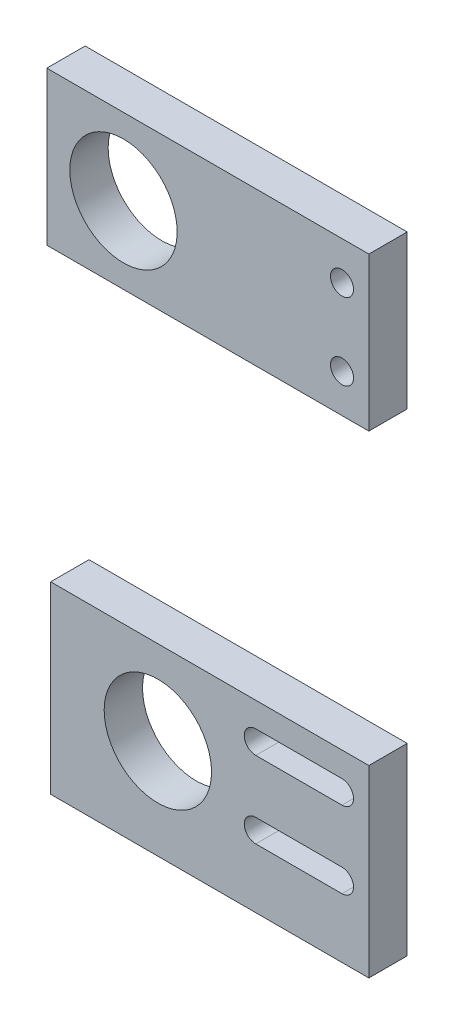
ISO-10303-21;
HEADER;
FILE_DESCRIPTION(('STEP AP214'),'2;1');
FILE_NAME('part.step','',(''),(''),'','','');
FILE_SCHEMA(('AUTOMOTIVE_DESIGN { 1 0 10303 214 1 1 1 1 }'));
ENDSEC;
DATA;
#1=APPLICATION_CONTEXT('core data for automotive mechanical design processes');
#2=APPLICATION_PROTOCOL_DEFINITION('international standard','automotive_design',2000,#1);
#3=PRODUCT_CONTEXT('',#1,'mechanical');
#4=PRODUCT('Part','Part','',(#3));
#5=PRODUCT_RELATED_PRODUCT_CATEGORY('part','',(#4));
#6=PRODUCT_DEFINITION_FORMATION('','',#4);
#7=PRODUCT_DEFINITION_CONTEXT('part definition',#1,'design');
#8=PRODUCT_DEFINITION('design','',#6,#7);
#9=PRODUCT_DEFINITION_SHAPE('','',#8);
#10=(LENGTH_UNIT() NAMED_UNIT(*) SI_UNIT(.MILLI.,.METRE.));
#11=(NAMED_UNIT(*) PLANE_ANGLE_UNIT() SI_UNIT($,.RADIAN.));
#12=(NAMED_UNIT(*) SI_UNIT($,.STERADIAN.) SOLID_ANGLE_UNIT());
#13=UNCERTAINTY_MEASURE_WITH_UNIT(LENGTH_MEASURE(1.E-05),#10,'distance_accuracy_value','');
#14=(GEOMETRIC_REPRESENTATION_CONTEXT(3) GLOBAL_UNCERTAINTY_ASSIGNED_CONTEXT((#13)) GLOBAL_UNIT_ASSIGNED_CONTEXT((#10,
#11,#12)) REPRESENTATION_CONTEXT('',''));
#15=CARTESIAN_POINT('',(0.,0.,0.));
#16=DIRECTION('',(0.,0.,1.));
#17=DIRECTION('',(1.,0.,0.));
#18=AXIS2_PLACEMENT_3D('',#15,#16,#17);
#19=CARTESIAN_POINT('',(0.,0.,-27.08));
#20=DIRECTION('',(0.,0.,-1.));
#21=DIRECTION('',(0.,1.,0.));
#22=AXIS2_PLACEMENT_3D('',#19,#20,#21);
#23=PLANE('',#22);
#24=CARTESIAN_POINT('',(0.,5.,-27.08));
#25=DIRECTION('',(0.,0.,-1.));
#26=DIRECTION('',(0.,1.,0.));
#27=AXIS2_PLACEMENT_3D('',#24,#25,#26);
#28=CIRCLE('',#27,1.5);
#29=CARTESIAN_POINT('',(0.,6.5,-27.08));
#30=VERTEX_POINT('',#29);
#31=EDGE_CURVE('E135',#30,#30,#28,.F.);
#32=ORIENTED_EDGE('',*,*,#31,.F.);
#33=EDGE_LOOP('',(#32));
#34=FACE_BOUND('',#33,.T.);
#35=DIRECTION('',(0.,-1.,0.));
#36=VECTOR('',#35,1.);
#37=CARTESIAN_POINT('',(3.5,0.,-27.08));
#38=LINE('',#37,#36);
#39=CARTESIAN_POINT('',(3.5,10.,-27.08));
#40=VERTEX_POINT('',#39);
#41=CARTESIAN_POINT('',(3.5,-10.,-27.08));
#42=VERTEX_POINT('',#41);
#43=EDGE_CURVE('E56',#40,#42,#38,.T.);
#44=ORIENTED_EDGE('',*,*,#43,.F.);
#45=DIRECTION('',(1.,0.,0.));
#46=VECTOR('',#45,1.);
#47=CARTESIAN_POINT('',(-38.5,10.,-27.08));
#48=LINE('',#47,#46);
#49=CARTESIAN_POINT('',(-38.5,10.,-27.08));
#50=VERTEX_POINT('',#49);
#51=EDGE_CURVE('E95',#50,#40,#48,.T.);
#52=ORIENTED_EDGE('',*,*,#51,.F.);
#53=DIRECTION('',(0.,1.,0.));
#54=VECTOR('',#53,1.);
#55=CARTESIAN_POINT('',(-38.5,10.,-27.08));
#56=LINE('',#55,#54);
#57=CARTESIAN_POINT('',(-38.5,-10.,-27.08));
#58=VERTEX_POINT('',#57);
#59=EDGE_CURVE('E129',#58,#50,#56,.T.);
#60=ORIENTED_EDGE('',*,*,#59,.F.);
#61=DIRECTION('',(-1.,0.,0.));
#62=VECTOR('',#61,1.);
#63=CARTESIAN_POINT('',(-3.5,-10.,-27.08));
#64=LINE('',#63,#62);
#65=EDGE_CURVE('E12',#42,#58,#64,.T.);
#66=ORIENTED_EDGE('',*,*,#65,.F.);
#67=EDGE_LOOP('',(#44,#52,#60,#66));
#68=FACE_BOUND('',#67,.T.);
#69=CARTESIAN_POINT('',(0.,-5.,-27.08));
#70=DIRECTION('',(0.,0.,-1.));
#71=DIRECTION('',(0.,1.,0.));
#72=AXIS2_PLACEMENT_3D('',#69,#70,#71);
#73=CIRCLE('',#72,1.5);
#74=CARTESIAN_POINT('',(0.,-3.5,-27.08));
#75=VERTEX_POINT('',#74);
#76=EDGE_CURVE('E106',#75,#75,#73,.F.);
#77=ORIENTED_EDGE('',*,*,#76,.F.);
#78=EDGE_LOOP('',(#77));
#79=FACE_BOUND('',#78,.T.);
#80=CARTESIAN_POINT('',(-28.5,0.,-27.08));
#81=DIRECTION('',(0.,0.,-1.));
#82=DIRECTION('',(0.,1.,0.));
#83=AXIS2_PLACEMENT_3D('',#80,#81,#82);
#84=CIRCLE('',#83,7.00000000000001);
#85=CARTESIAN_POINT('',(-28.5,7.00000000000001,-27.08));
#86=VERTEX_POINT('',#85);
#87=EDGE_CURVE('E119',#86,#86,#84,.T.);
#88=ORIENTED_EDGE('',*,*,#87,.T.);
#89=EDGE_LOOP('',(#88));
#90=FACE_BOUND('',#89,.T.);
#91=ADVANCED_FACE('F52',(#34,#68,#79,#90),#23,.F.);
#92=CARTESIAN_POINT('',(-38.5,0.,0.));
#93=DIRECTION('',(-1.,0.,0.));
#94=DIRECTION('',(0.,0.,1.));
#95=AXIS2_PLACEMENT_3D('',#92,#93,#94);
#96=PLANE('',#95);
#97=DIRECTION('',(0.,-1.,0.));
#98=VECTOR('',#97,1.);
#99=CARTESIAN_POINT('',(-38.5,10.,-32.08));
#100=LINE('',#99,#98);
#101=CARTESIAN_POINT('',(-38.5,10.,-32.08));
#102=VERTEX_POINT('',#101);
#103=CARTESIAN_POINT('',(-38.5,-10.,-32.08));
#104=VERTEX_POINT('',#103);
#105=EDGE_CURVE('E123',#102,#104,#100,.T.);
#106=ORIENTED_EDGE('',*,*,#105,.T.);
#107=DIRECTION('',(0.,0.,1.));
#108=VECTOR('',#107,1.);
#109=CARTESIAN_POINT('',(-38.5,-10.,-32.08));
#110=LINE('',#109,#108);
#111=EDGE_CURVE('E126',#104,#58,#110,.T.);
#112=ORIENTED_EDGE('',*,*,#111,.T.);
#113=ORIENTED_EDGE('',*,*,#59,.T.);
#114=DIRECTION('',(0.,0.,-1.));
#115=VECTOR('',#114,1.);
#116=CARTESIAN_POINT('',(-38.5,10.,-32.08));
#117=LINE('',#116,#115);
#118=EDGE_CURVE('E99',#50,#102,#117,.T.);
#119=ORIENTED_EDGE('',*,*,#118,.T.);
#120=EDGE_LOOP('',(#106,#112,#113,#119));
#121=FACE_BOUND('',#120,.T.);
#122=ADVANCED_FACE('F144',(#121),#96,.T.);
#123=CARTESIAN_POINT('',(-3.5,10.,-32.08));
#124=DIRECTION('',(0.,0.,-1.));
#125=DIRECTION('',(-1.,0.,0.));
#126=AXIS2_PLACEMENT_3D('',#123,#124,#125);
#127=PLANE('',#126);
#128=CARTESIAN_POINT('',(0.,5.,-32.08));
#129=DIRECTION('',(0.,0.,-1.));
#130=DIRECTION('',(-1.,0.,0.));
#131=AXIS2_PLACEMENT_3D('',#128,#129,#130);
#132=CIRCLE('',#131,1.5);
#133=CARTESIAN_POINT('',(-1.5,5.,-32.08));
#134=VERTEX_POINT('',#133);
#135=EDGE_CURVE('E120',#134,#134,#132,.T.);
#136=ORIENTED_EDGE('',*,*,#135,.F.);
#137=EDGE_LOOP('',(#136));
#138=FACE_BOUND('',#137,.T.);
#139=CARTESIAN_POINT('',(0.,-5.,-32.08));
#140=DIRECTION('',(0.,0.,-1.));
#141=DIRECTION('',(-1.,0.,0.));
#142=AXIS2_PLACEMENT_3D('',#139,#140,#141);
#143=CIRCLE('',#142,1.5);
#144=CARTESIAN_POINT('',(-1.5,-5.,-32.08));
#145=VERTEX_POINT('',#144);
#146=EDGE_CURVE('E133',#145,#145,#143,.T.);
#147=ORIENTED_EDGE('',*,*,#146,.F.);
#148=EDGE_LOOP('',(#147));
#149=FACE_BOUND('',#148,.T.);
#150=CARTESIAN_POINT('',(-28.5,0.,-32.08));
#151=DIRECTION('',(0.,0.,-1.));
#152=DIRECTION('',(-1.,0.,0.));
#153=AXIS2_PLACEMENT_3D('',#150,#151,#152);
#154=CIRCLE('',#153,7.00000000000001);
#155=CARTESIAN_POINT('',(-35.5,0.,-32.08));
#156=VERTEX_POINT('',#155);
#157=EDGE_CURVE('E116',#156,#156,#154,.T.);
#158=ORIENTED_EDGE('',*,*,#157,.F.);
#159=EDGE_LOOP('',(#158));
#160=FACE_BOUND('',#159,.T.);
#161=DIRECTION('',(1.,0.,0.));
#162=VECTOR('',#161,1.);
#163=CARTESIAN_POINT('',(-3.5,10.,-32.08));
#164=LINE('',#163,#162);
#165=CARTESIAN_POINT('',(3.5,10.,-32.08));
#166=VERTEX_POINT('',#165);
#167=EDGE_CURVE('E61',#102,#166,#164,.T.);
#168=ORIENTED_EDGE('',*,*,#167,.T.);
#169=DIRECTION('',(0.,1.,0.));
#170=VECTOR('',#169,1.);
#171=CARTESIAN_POINT('',(3.5,10.,-32.08));
#172=LINE('',#171,#170);
#173=CARTESIAN_POINT('',(3.5,-10.,-32.08));
#174=VERTEX_POINT('',#173);
#175=EDGE_CURVE('E107',#174,#166,#172,.T.);
#176=ORIENTED_EDGE('',*,*,#175,.F.);
#177=DIRECTION('',(1.,0.,0.));
#178=VECTOR('',#177,1.);
#179=CARTESIAN_POINT('',(-3.5,-10.,-32.08));
#180=LINE('',#179,#178);
#181=EDGE_CURVE('E108',#104,#174,#180,.T.);
#182=ORIENTED_EDGE('',*,*,#181,.F.);
#183=ORIENTED_EDGE('',*,*,#105,.F.);
#184=EDGE_LOOP('',(#168,#176,#182,#183));
#185=FACE_BOUND('',#184,.T.);
#186=ADVANCED_FACE('F141',(#138,#149,#160,#185),#127,.T.);
#187=CARTESIAN_POINT('',(3.5,0.,0.));
#188=DIRECTION('',(-1.,0.,0.));
#189=DIRECTION('',(0.,0.,1.));
#190=AXIS2_PLACEMENT_3D('',#187,#188,#189);
#191=PLANE('',#190);
#192=DIRECTION('',(0.,0.,1.));
#193=VECTOR('',#192,1.);
#194=CARTESIAN_POINT('',(3.5,10.,32.08));
#195=LINE('',#194,#193);
#196=EDGE_CURVE('E97',#166,#40,#195,.T.);
#197=ORIENTED_EDGE('',*,*,#196,.T.);
#198=ORIENTED_EDGE('',*,*,#43,.T.);
#199=DIRECTION('',(0.,0.,-1.));
#200=VECTOR('',#199,1.);
#201=CARTESIAN_POINT('',(3.5,-10.,32.08));
#202=LINE('',#201,#200);
#203=EDGE_CURVE('E102',#42,#174,#202,.T.);
#204=ORIENTED_EDGE('',*,*,#203,.T.);
#205=ORIENTED_EDGE('',*,*,#175,.T.);
#206=EDGE_LOOP('',(#197,#198,#204,#205));
#207=FACE_BOUND('',#206,.T.);
#208=ADVANCED_FACE('F54',(#207),#191,.F.);
#209=CARTESIAN_POINT('',(-3.5,10.,32.08));
#210=DIRECTION('',(0.,1.,0.));
#211=DIRECTION('',(0.,0.,1.));
#212=AXIS2_PLACEMENT_3D('',#209,#210,#211);
#213=PLANE('',#212);
#214=ORIENTED_EDGE('',*,*,#51,.T.);
#215=ORIENTED_EDGE('',*,*,#196,.F.);
#216=ORIENTED_EDGE('',*,*,#167,.F.);
#217=ORIENTED_EDGE('',*,*,#118,.F.);
#218=EDGE_LOOP('',(#214,#215,#216,#217));
#219=FACE_BOUND('',#218,.T.);
#220=ADVANCED_FACE('F96',(#219),#213,.T.);
#221=CARTESIAN_POINT('',(-3.5,-10.,32.08));
#222=DIRECTION('',(0.,-1.,0.));
#223=DIRECTION('',(0.,0.,-1.));
#224=AXIS2_PLACEMENT_3D('',#221,#222,#223);
#225=PLANE('',#224);
#226=ORIENTED_EDGE('',*,*,#203,.F.);
#227=ORIENTED_EDGE('',*,*,#65,.T.);
#228=ORIENTED_EDGE('',*,*,#111,.F.);
#229=ORIENTED_EDGE('',*,*,#181,.T.);
#230=EDGE_LOOP('',(#226,#227,#228,#229));
#231=FACE_BOUND('',#230,.T.);
#232=ADVANCED_FACE('F153',(#231),#225,.T.);
#233=CARTESIAN_POINT('',(-28.5,0.,32.08));
#234=DIRECTION('',(0.,0.,-1.));
#235=DIRECTION('',(-1.,0.,0.));
#236=AXIS2_PLACEMENT_3D('',#233,#234,#235);
#237=CYLINDRICAL_SURFACE('',#236,7.00000000000001);
#238=ORIENTED_EDGE('',*,*,#157,.T.);
#239=EDGE_LOOP('',(#238));
#240=FACE_BOUND('',#239,.T.);
#241=ORIENTED_EDGE('',*,*,#87,.F.);
#242=EDGE_LOOP('',(#241));
#243=FACE_BOUND('',#242,.T.);
#244=ADVANCED_FACE('F150',(#240,#243),#237,.F.);
#245=CARTESIAN_POINT('',(0.,5.,-39.58));
#246=DIRECTION('',(0.,0.,1.));
#247=DIRECTION('',(1.,0.,0.));
#248=AXIS2_PLACEMENT_3D('',#245,#246,#247);
#249=CYLINDRICAL_SURFACE('',#248,1.5);
#250=ORIENTED_EDGE('',*,*,#31,.T.);
#251=EDGE_LOOP('',(#250));
#252=FACE_BOUND('',#251,.T.);
#253=ORIENTED_EDGE('',*,*,#135,.T.);
#254=EDGE_LOOP('',(#253));
#255=FACE_BOUND('',#254,.T.);
#256=ADVANCED_FACE('F139',(#252,#255),#249,.F.);
#257=CARTESIAN_POINT('',(0.,-5.,-39.58));
#258=DIRECTION('',(0.,0.,1.));
#259=DIRECTION('',(1.,0.,0.));
#260=AXIS2_PLACEMENT_3D('',#257,#258,#259);
#261=CYLINDRICAL_SURFACE('',#260,1.5);
#262=ORIENTED_EDGE('',*,*,#76,.T.);
#263=EDGE_LOOP('',(#262));
#264=FACE_BOUND('',#263,.T.);
#265=ORIENTED_EDGE('',*,*,#146,.T.);
#266=EDGE_LOOP('',(#265));
#267=FACE_BOUND('',#266,.T.);
#268=ADVANCED_FACE('F159',(#264,#267),#261,.F.);
#269=CLOSED_SHELL('',(#91,#122,#186,#208,#220,#232,#244,#256,#268));
#270=MANIFOLD_SOLID_BREP('B2',#269);
#271=CARTESIAN_POINT('',(-11.25,-52.5,-39.58));
#272=DIRECTION('',(0.,0.,1.));
#273=DIRECTION('',(1.,0.,0.));
#274=AXIS2_PLACEMENT_3D('',#271,#272,#273);
#275=CYLINDRICAL_SURFACE('',#274,1.5);
#276=DIRECTION('',(0.,0.,1.));
#277=VECTOR('',#276,1.);
#278=CARTESIAN_POINT('',(-11.25,-51.,-39.58));
#279=LINE('',#278,#277);
#280=CARTESIAN_POINT('',(-11.25,-51.,-32.08));
#281=VERTEX_POINT('',#280);
#282=CARTESIAN_POINT('',(-11.25,-51.,-27.08));
#283=VERTEX_POINT('',#282);
#284=EDGE_CURVE('E495',#281,#283,#279,.T.);
#285=ORIENTED_EDGE('',*,*,#284,.T.);
#286=CARTESIAN_POINT('',(-11.25,-52.5,-27.08));
#287=DIRECTION('',(0.,0.,-1.));
#288=DIRECTION('',(-1.,0.,0.));
#289=AXIS2_PLACEMENT_3D('',#286,#287,#288);
#290=CIRCLE('',#289,1.5);
#291=CARTESIAN_POINT('',(-11.25,-54.,-27.08));
#292=VERTEX_POINT('',#291);
#293=EDGE_CURVE('E421',#292,#283,#290,.T.);
#294=ORIENTED_EDGE('',*,*,#293,.F.);
#295=DIRECTION('',(0.,0.,1.));
#296=VECTOR('',#295,1.);
#297=CARTESIAN_POINT('',(-11.25,-54.,-39.58));
#298=LINE('',#297,#296);
#299=CARTESIAN_POINT('',(-11.25,-54.,-32.08));
#300=VERTEX_POINT('',#299);
#301=EDGE_CURVE('E498',#300,#292,#298,.T.);
#302=ORIENTED_EDGE('',*,*,#301,.F.);
#303=CARTESIAN_POINT('',(-11.25,-52.5,-32.08));
#304=DIRECTION('',(0.,0.,-1.));
#305=DIRECTION('',(-1.,0.,0.));
#306=AXIS2_PLACEMENT_3D('',#303,#304,#305);
#307=CIRCLE('',#306,1.5);
#308=EDGE_CURVE('E425',#300,#281,#307,.T.);
#309=ORIENTED_EDGE('',*,*,#308,.T.);
#310=EDGE_LOOP('',(#285,#294,#302,#309));
#311=FACE_BOUND('',#310,.T.);
#312=ADVANCED_FACE('F304',(#311),#275,.F.);
#313=CARTESIAN_POINT('',(-11.25,-62.5,-39.58));
#314=DIRECTION('',(0.,0.,1.));
#315=DIRECTION('',(1.,0.,0.));
#316=AXIS2_PLACEMENT_3D('',#313,#314,#315);
#317=CYLINDRICAL_SURFACE('',#316,1.5);
#318=DIRECTION('',(0.,0.,1.));
#319=VECTOR('',#318,1.);
#320=CARTESIAN_POINT('',(-11.25,-61.,-39.58));
#321=LINE('',#320,#319);
#322=CARTESIAN_POINT('',(-11.25,-61.,-32.08));
#323=VERTEX_POINT('',#322);
#324=CARTESIAN_POINT('',(-11.25,-61.,-27.08));
#325=VERTEX_POINT('',#324);
#326=EDGE_CURVE('E481',#323,#325,#321,.T.);
#327=ORIENTED_EDGE('',*,*,#326,.T.);
#328=CARTESIAN_POINT('',(-11.25,-62.5,-27.08));
#329=DIRECTION('',(0.,0.,-1.));
#330=DIRECTION('',(-1.,0.,0.));
#331=AXIS2_PLACEMENT_3D('',#328,#329,#330);
#332=CIRCLE('',#331,1.5);
#333=CARTESIAN_POINT('',(-11.25,-64.,-27.08));
#334=VERTEX_POINT('',#333);
#335=EDGE_CURVE('E470',#334,#325,#332,.T.);
#336=ORIENTED_EDGE('',*,*,#335,.F.);
#337=DIRECTION('',(0.,0.,1.));
#338=VECTOR('',#337,1.);
#339=CARTESIAN_POINT('',(-11.25,-64.,-39.58));
#340=LINE('',#339,#338);
#341=CARTESIAN_POINT('',(-11.25,-64.,-32.08));
#342=VERTEX_POINT('',#341);
#343=EDGE_CURVE('E483',#342,#334,#340,.T.);
#344=ORIENTED_EDGE('',*,*,#343,.F.);
#345=CARTESIAN_POINT('',(-11.25,-62.5,-32.08));
#346=DIRECTION('',(0.,0.,-1.));
#347=DIRECTION('',(-1.,0.,0.));
#348=AXIS2_PLACEMENT_3D('',#345,#346,#347);
#349=CIRCLE('',#348,1.5);
#350=EDGE_CURVE('E415',#342,#323,#349,.T.);
#351=ORIENTED_EDGE('',*,*,#350,.T.);
#352=EDGE_LOOP('',(#327,#336,#344,#351));
#353=FACE_BOUND('',#352,.T.);
#354=ADVANCED_FACE('F503',(#353),#317,.F.);
#355=CARTESIAN_POINT('',(0.,0.,-27.08));
#356=DIRECTION('',(0.,0.,-1.));
#357=DIRECTION('',(1.,0.,0.));
#358=AXIS2_PLACEMENT_3D('',#355,#356,#357);
#359=PLANE('',#358);
#360=CARTESIAN_POINT('',(-24.02,-58.77,-27.08));
#361=DIRECTION('',(0.,0.,-1.));
#362=DIRECTION('',(-1.,0.,0.));
#363=AXIS2_PLACEMENT_3D('',#360,#361,#362);
#364=CIRCLE('',#363,7.);
#365=CARTESIAN_POINT('',(-31.02,-58.77,-27.08));
#366=VERTEX_POINT('',#365);
#367=EDGE_CURVE('E434',#366,#366,#364,.T.);
#368=ORIENTED_EDGE('',*,*,#367,.T.);
#369=EDGE_LOOP('',(#368));
#370=FACE_BOUND('',#369,.T.);
#371=DIRECTION('',(1.,0.,0.));
#372=VECTOR('',#371,1.);
#373=CARTESIAN_POINT('',(3.5,-71.77,-27.08));
#374=LINE('',#373,#372);
#375=CARTESIAN_POINT('',(-38.,-71.77,-27.08));
#376=VERTEX_POINT('',#375);
#377=CARTESIAN_POINT('',(3.5,-71.77,-27.08));
#378=VERTEX_POINT('',#377);
#379=EDGE_CURVE('E438',#376,#378,#374,.T.);
#380=ORIENTED_EDGE('',*,*,#379,.T.);
#381=DIRECTION('',(0.,-1.,0.));
#382=VECTOR('',#381,1.);
#383=CARTESIAN_POINT('',(3.5,0.,-27.08));
#384=LINE('',#383,#382);
#385=CARTESIAN_POINT('',(3.5,-47.77,-27.08));
#386=VERTEX_POINT('',#385);
#387=EDGE_CURVE('E50',#386,#378,#384,.T.);
#388=ORIENTED_EDGE('',*,*,#387,.F.);
#389=DIRECTION('',(-1.,0.,0.));
#390=VECTOR('',#389,1.);
#391=CARTESIAN_POINT('',(3.5,-47.77,-27.08));
#392=LINE('',#391,#390);
#393=CARTESIAN_POINT('',(-38.,-47.77,-27.08));
#394=VERTEX_POINT('',#393);
#395=EDGE_CURVE('E451',#386,#394,#392,.T.);
#396=ORIENTED_EDGE('',*,*,#395,.T.);
#397=DIRECTION('',(0.,-1.,0.));
#398=VECTOR('',#397,1.);
#399=CARTESIAN_POINT('',(-38.,-71.77,-27.08));
#400=LINE('',#399,#398);
#401=EDGE_CURVE('E453',#394,#376,#400,.T.);
#402=ORIENTED_EDGE('',*,*,#401,.T.);
#403=EDGE_LOOP('',(#380,#388,#396,#402));
#404=FACE_BOUND('',#403,.T.);
#405=ORIENTED_EDGE('',*,*,#293,.T.);
#406=DIRECTION('',(-1.,0.,0.));
#407=VECTOR('',#406,1.);
#408=CARTESIAN_POINT('',(0.,-51.,-27.08));
#409=LINE('',#408,#407);
#410=CARTESIAN_POINT('',(0.,-51.,-27.08));
#411=VERTEX_POINT('',#410);
#412=EDGE_CURVE('E493',#411,#283,#409,.T.);
#413=ORIENTED_EDGE('',*,*,#412,.F.);
#414=CARTESIAN_POINT('',(0.,-52.5,-27.08));
#415=DIRECTION('',(0.,0.,-1.));
#416=DIRECTION('',(0.,1.,0.));
#417=AXIS2_PLACEMENT_3D('',#414,#415,#416);
#418=CIRCLE('',#417,1.5);
#419=CARTESIAN_POINT('',(0.,-54.,-27.08));
#420=VERTEX_POINT('',#419);
#421=EDGE_CURVE('E433',#420,#411,#418,.F.);
#422=ORIENTED_EDGE('',*,*,#421,.F.);
#423=DIRECTION('',(1.,0.,0.));
#424=VECTOR('',#423,1.);
#425=CARTESIAN_POINT('',(0.,-54.,-27.08));
#426=LINE('',#425,#424);
#427=EDGE_CURVE('E328',#292,#420,#426,.T.);
#428=ORIENTED_EDGE('',*,*,#427,.F.);
#429=EDGE_LOOP('',(#405,#413,#422,#428));
#430=FACE_BOUND('',#429,.T.);
#431=ORIENTED_EDGE('',*,*,#335,.T.);
#432=DIRECTION('',(-1.,0.,0.));
#433=VECTOR('',#432,1.);
#434=CARTESIAN_POINT('',(0.,-61.,-27.08));
#435=LINE('',#434,#433);
#436=CARTESIAN_POINT('',(0.,-61.,-27.08));
#437=VERTEX_POINT('',#436);
#438=EDGE_CURVE('E417',#437,#325,#435,.T.);
#439=ORIENTED_EDGE('',*,*,#438,.F.);
#440=CARTESIAN_POINT('',(0.,-62.5,-27.08));
#441=DIRECTION('',(0.,0.,-1.));
#442=DIRECTION('',(0.,1.,0.));
#443=AXIS2_PLACEMENT_3D('',#440,#441,#442);
#444=CIRCLE('',#443,1.5);
#445=CARTESIAN_POINT('',(0.,-64.,-27.08));
#446=VERTEX_POINT('',#445);
#447=EDGE_CURVE('E308',#446,#437,#444,.F.);
#448=ORIENTED_EDGE('',*,*,#447,.F.);
#449=DIRECTION('',(1.,0.,0.));
#450=VECTOR('',#449,1.);
#451=CARTESIAN_POINT('',(0.,-64.,-27.08));
#452=LINE('',#451,#450);
#453=EDGE_CURVE('E399',#334,#446,#452,.T.);
#454=ORIENTED_EDGE('',*,*,#453,.F.);
#455=EDGE_LOOP('',(#431,#439,#448,#454));
#456=FACE_BOUND('',#455,.T.);
#457=ADVANCED_FACE('F477',(#370,#404,#430,#456),#359,.F.);
#458=CARTESIAN_POINT('',(3.5,-71.77,-32.08));
#459=DIRECTION('',(0.,-1.,0.));
#460=DIRECTION('',(1.,0.,0.));
#461=AXIS2_PLACEMENT_3D('',#458,#459,#460);
#462=PLANE('',#461);
#463=DIRECTION('',(0.,0.,1.));
#464=VECTOR('',#463,1.);
#465=CARTESIAN_POINT('',(3.5,-71.77,-32.08));
#466=LINE('',#465,#464);
#467=CARTESIAN_POINT('',(3.5,-71.77,-32.08));
#468=VERTEX_POINT('',#467);
#469=EDGE_CURVE('E439',#468,#378,#466,.T.);
#470=ORIENTED_EDGE('',*,*,#469,.T.);
#471=ORIENTED_EDGE('',*,*,#379,.F.);
#472=DIRECTION('',(0.,0.,1.));
#473=VECTOR('',#472,1.);
#474=CARTESIAN_POINT('',(-38.,-71.77,-32.08));
#475=LINE('',#474,#473);
#476=CARTESIAN_POINT('',(-38.,-71.77,-32.08));
#477=VERTEX_POINT('',#476);
#478=EDGE_CURVE('E442',#477,#376,#475,.T.);
#479=ORIENTED_EDGE('',*,*,#478,.F.);
#480=DIRECTION('',(1.,0.,0.));
#481=VECTOR('',#480,1.);
#482=CARTESIAN_POINT('',(3.5,-71.77,-32.08));
#483=LINE('',#482,#481);
#484=EDGE_CURVE('E463',#477,#468,#483,.T.);
#485=ORIENTED_EDGE('',*,*,#484,.T.);
#486=EDGE_LOOP('',(#470,#471,#479,#485));
#487=FACE_BOUND('',#486,.T.);
#488=ADVANCED_FACE('F544',(#487),#462,.T.);
#489=CARTESIAN_POINT('',(-38.,-71.77,-32.08));
#490=DIRECTION('',(-1.,0.,0.));
#491=DIRECTION('',(0.,0.,1.));
#492=AXIS2_PLACEMENT_3D('',#489,#490,#491);
#493=PLANE('',#492);
#494=ORIENTED_EDGE('',*,*,#401,.F.);
#495=DIRECTION('',(0.,0.,1.));
#496=VECTOR('',#495,1.);
#497=CARTESIAN_POINT('',(-38.,-47.77,-32.08));
#498=LINE('',#497,#496);
#499=CARTESIAN_POINT('',(-38.,-47.77,-32.08));
#500=VERTEX_POINT('',#499);
#501=EDGE_CURVE('E444',#500,#394,#498,.T.);
#502=ORIENTED_EDGE('',*,*,#501,.F.);
#503=DIRECTION('',(0.,-1.,0.));
#504=VECTOR('',#503,1.);
#505=CARTESIAN_POINT('',(-38.,-71.77,-32.08));
#506=LINE('',#505,#504);
#507=EDGE_CURVE('E460',#500,#477,#506,.T.);
#508=ORIENTED_EDGE('',*,*,#507,.T.);
#509=ORIENTED_EDGE('',*,*,#478,.T.);
#510=EDGE_LOOP('',(#494,#502,#508,#509));
#511=FACE_BOUND('',#510,.T.);
#512=ADVANCED_FACE('F557',(#511),#493,.T.);
#513=CARTESIAN_POINT('',(0.,0.,-32.08));
#514=DIRECTION('',(0.,0.,-1.));
#515=DIRECTION('',(1.,0.,0.));
#516=AXIS2_PLACEMENT_3D('',#513,#514,#515);
#517=PLANE('',#516);
#518=DIRECTION('',(1.,0.,0.));
#519=VECTOR('',#518,1.);
#520=CARTESIAN_POINT('',(0.,-61.,-32.08));
#521=LINE('',#520,#519);
#522=CARTESIAN_POINT('',(0.,-61.,-32.08));
#523=VERTEX_POINT('',#522);
#524=EDGE_CURVE('E416',#323,#523,#521,.T.);
#525=ORIENTED_EDGE('',*,*,#524,.F.);
#526=ORIENTED_EDGE('',*,*,#350,.F.);
#527=DIRECTION('',(-1.,0.,0.));
#528=VECTOR('',#527,1.);
#529=CARTESIAN_POINT('',(0.,-64.,-32.08));
#530=LINE('',#529,#528);
#531=CARTESIAN_POINT('',(0.,-64.,-32.08));
#532=VERTEX_POINT('',#531);
#533=EDGE_CURVE('E396',#532,#342,#530,.T.);
#534=ORIENTED_EDGE('',*,*,#533,.F.);
#535=CARTESIAN_POINT('',(0.,-62.5,-32.08));
#536=DIRECTION('',(0.,0.,-1.));
#537=DIRECTION('',(-1.,0.,0.));
#538=AXIS2_PLACEMENT_3D('',#535,#536,#537);
#539=CIRCLE('',#538,1.5);
#540=EDGE_CURVE('E413',#523,#532,#539,.T.);
#541=ORIENTED_EDGE('',*,*,#540,.F.);
#542=EDGE_LOOP('',(#525,#526,#534,#541));
#543=FACE_BOUND('',#542,.T.);
#544=DIRECTION('',(1.,0.,0.));
#545=VECTOR('',#544,1.);
#546=CARTESIAN_POINT('',(0.,-51.,-32.08));
#547=LINE('',#546,#545);
#548=CARTESIAN_POINT('',(0.,-51.,-32.08));
#549=VERTEX_POINT('',#548);
#550=EDGE_CURVE('E320',#281,#549,#547,.T.);
#551=ORIENTED_EDGE('',*,*,#550,.F.);
#552=ORIENTED_EDGE('',*,*,#308,.F.);
#553=DIRECTION('',(-1.,0.,0.));
#554=VECTOR('',#553,1.);
#555=CARTESIAN_POINT('',(0.,-54.,-32.08));
#556=LINE('',#555,#554);
#557=CARTESIAN_POINT('',(0.,-54.,-32.08));
#558=VERTEX_POINT('',#557);
#559=EDGE_CURVE('E491',#558,#300,#556,.T.);
#560=ORIENTED_EDGE('',*,*,#559,.F.);
#561=CARTESIAN_POINT('',(0.,-52.5,-32.08));
#562=DIRECTION('',(0.,0.,-1.));
#563=DIRECTION('',(-1.,0.,0.));
#564=AXIS2_PLACEMENT_3D('',#561,#562,#563);
#565=CIRCLE('',#564,1.5);
#566=EDGE_CURVE('E422',#549,#558,#565,.T.);
#567=ORIENTED_EDGE('',*,*,#566,.F.);
#568=EDGE_LOOP('',(#551,#552,#560,#567));
#569=FACE_BOUND('',#568,.T.);
#570=CARTESIAN_POINT('',(-24.02,-58.77,-32.08));
#571=DIRECTION('',(0.,0.,-1.));
#572=DIRECTION('',(-1.,0.,0.));
#573=AXIS2_PLACEMENT_3D('',#570,#571,#572);
#574=CIRCLE('',#573,7.);
#575=CARTESIAN_POINT('',(-31.02,-58.77,-32.08));
#576=VERTEX_POINT('',#575);
#577=EDGE_CURVE('E437',#576,#576,#574,.T.);
#578=ORIENTED_EDGE('',*,*,#577,.F.);
#579=EDGE_LOOP('',(#578));
#580=FACE_BOUND('',#579,.T.);
#581=DIRECTION('',(0.,1.,0.));
#582=VECTOR('',#581,1.);
#583=CARTESIAN_POINT('',(3.5,-71.77,-32.08));
#584=LINE('',#583,#582);
#585=CARTESIAN_POINT('',(3.5,-47.77,-32.08));
#586=VERTEX_POINT('',#585);
#587=EDGE_CURVE('E454',#468,#586,#584,.T.);
#588=ORIENTED_EDGE('',*,*,#587,.F.);
#589=ORIENTED_EDGE('',*,*,#484,.F.);
#590=ORIENTED_EDGE('',*,*,#507,.F.);
#591=DIRECTION('',(-1.,0.,0.));
#592=VECTOR('',#591,1.);
#593=CARTESIAN_POINT('',(3.5,-47.77,-32.08));
#594=LINE('',#593,#592);
#595=EDGE_CURVE('E450',#586,#500,#594,.T.);
#596=ORIENTED_EDGE('',*,*,#595,.F.);
#597=EDGE_LOOP('',(#588,#589,#590,#596));
#598=FACE_BOUND('',#597,.T.);
#599=ADVANCED_FACE('F411',(#543,#569,#580,#598),#517,.T.);
#600=CARTESIAN_POINT('',(3.5,0.,0.));
#601=DIRECTION('',(-1.,0.,0.));
#602=DIRECTION('',(0.,0.,1.));
#603=AXIS2_PLACEMENT_3D('',#600,#601,#602);
#604=PLANE('',#603);
#605=DIRECTION('',(0.,0.,1.));
#606=VECTOR('',#605,1.);
#607=CARTESIAN_POINT('',(3.5,-47.77,-32.08));
#608=LINE('',#607,#606);
#609=EDGE_CURVE('E447',#586,#386,#608,.T.);
#610=ORIENTED_EDGE('',*,*,#609,.T.);
#611=ORIENTED_EDGE('',*,*,#387,.T.);
#612=ORIENTED_EDGE('',*,*,#469,.F.);
#613=ORIENTED_EDGE('',*,*,#587,.T.);
#614=EDGE_LOOP('',(#610,#611,#612,#613));
#615=FACE_BOUND('',#614,.T.);
#616=ADVANCED_FACE('F306',(#615),#604,.F.);
#617=CARTESIAN_POINT('',(3.5,-47.77,-32.08));
#618=DIRECTION('',(0.,1.,0.));
#619=DIRECTION('',(-1.,0.,0.));
#620=AXIS2_PLACEMENT_3D('',#617,#618,#619);
#621=PLANE('',#620);
#622=ORIENTED_EDGE('',*,*,#395,.F.);
#623=ORIENTED_EDGE('',*,*,#609,.F.);
#624=ORIENTED_EDGE('',*,*,#595,.T.);
#625=ORIENTED_EDGE('',*,*,#501,.T.);
#626=EDGE_LOOP('',(#622,#623,#624,#625));
#627=FACE_BOUND('',#626,.T.);
#628=ADVANCED_FACE('F530',(#627),#621,.T.);
#629=CARTESIAN_POINT('',(-24.02,-58.77,32.08));
#630=DIRECTION('',(0.,0.,-1.));
#631=DIRECTION('',(-1.,0.,0.));
#632=AXIS2_PLACEMENT_3D('',#629,#630,#631);
#633=CYLINDRICAL_SURFACE('',#632,7.);
#634=ORIENTED_EDGE('',*,*,#577,.T.);
#635=EDGE_LOOP('',(#634));
#636=FACE_BOUND('',#635,.T.);
#637=ORIENTED_EDGE('',*,*,#367,.F.);
#638=EDGE_LOOP('',(#637));
#639=FACE_BOUND('',#638,.T.);
#640=ADVANCED_FACE('F528',(#636,#639),#633,.F.);
#641=CARTESIAN_POINT('',(0.,-52.5,-39.58));
#642=DIRECTION('',(0.,0.,1.));
#643=DIRECTION('',(1.,0.,0.));
#644=AXIS2_PLACEMENT_3D('',#641,#642,#643);
#645=CYLINDRICAL_SURFACE('',#644,1.5);
#646=ORIENTED_EDGE('',*,*,#421,.T.);
#647=DIRECTION('',(0.,0.,1.));
#648=VECTOR('',#647,1.);
#649=CARTESIAN_POINT('',(0.,-51.,-39.58));
#650=LINE('',#649,#648);
#651=EDGE_CURVE('E500',#549,#411,#650,.T.);
#652=ORIENTED_EDGE('',*,*,#651,.F.);
#653=ORIENTED_EDGE('',*,*,#566,.T.);
#654=DIRECTION('',(0.,0.,1.));
#655=VECTOR('',#654,1.);
#656=CARTESIAN_POINT('',(0.,-54.,-39.58));
#657=LINE('',#656,#655);
#658=EDGE_CURVE('E405',#558,#420,#657,.T.);
#659=ORIENTED_EDGE('',*,*,#658,.T.);
#660=EDGE_LOOP('',(#646,#652,#653,#659));
#661=FACE_BOUND('',#660,.T.);
#662=ADVANCED_FACE('F525',(#661),#645,.F.);
#663=CARTESIAN_POINT('',(0.,-62.5,-39.58));
#664=DIRECTION('',(0.,0.,1.));
#665=DIRECTION('',(1.,0.,0.));
#666=AXIS2_PLACEMENT_3D('',#663,#664,#665);
#667=CYLINDRICAL_SURFACE('',#666,1.5);
#668=ORIENTED_EDGE('',*,*,#447,.T.);
#669=DIRECTION('',(0.,0.,1.));
#670=VECTOR('',#669,1.);
#671=CARTESIAN_POINT('',(0.,-61.,-39.58));
#672=LINE('',#671,#670);
#673=EDGE_CURVE('E404',#523,#437,#672,.T.);
#674=ORIENTED_EDGE('',*,*,#673,.F.);
#675=ORIENTED_EDGE('',*,*,#540,.T.);
#676=DIRECTION('',(0.,0.,1.));
#677=VECTOR('',#676,1.);
#678=CARTESIAN_POINT('',(0.,-64.,-39.58));
#679=LINE('',#678,#677);
#680=EDGE_CURVE('E393',#532,#446,#679,.T.);
#681=ORIENTED_EDGE('',*,*,#680,.T.);
#682=EDGE_LOOP('',(#668,#674,#675,#681));
#683=FACE_BOUND('',#682,.T.);
#684=ADVANCED_FACE('F420',(#683),#667,.F.);
#685=CARTESIAN_POINT('',(0.,-64.,-27.079));
#686=DIRECTION('',(0.,-1.,0.));
#687=DIRECTION('',(0.,0.,-1.));
#688=AXIS2_PLACEMENT_3D('',#685,#686,#687);
#689=PLANE('',#688);
#690=ORIENTED_EDGE('',*,*,#453,.T.);
#691=ORIENTED_EDGE('',*,*,#680,.F.);
#692=ORIENTED_EDGE('',*,*,#533,.T.);
#693=ORIENTED_EDGE('',*,*,#343,.T.);
#694=EDGE_LOOP('',(#690,#691,#692,#693));
#695=FACE_BOUND('',#694,.T.);
#696=ADVANCED_FACE('F395',(#695),#689,.F.);
#697=CARTESIAN_POINT('',(0.,-61.,-27.079));
#698=DIRECTION('',(0.,1.,0.));
#699=DIRECTION('',(0.,0.,1.));
#700=AXIS2_PLACEMENT_3D('',#697,#698,#699);
#701=PLANE('',#700);
#702=ORIENTED_EDGE('',*,*,#438,.T.);
#703=ORIENTED_EDGE('',*,*,#326,.F.);
#704=ORIENTED_EDGE('',*,*,#524,.T.);
#705=ORIENTED_EDGE('',*,*,#673,.T.);
#706=EDGE_LOOP('',(#702,#703,#704,#705));
#707=FACE_BOUND('',#706,.T.);
#708=ADVANCED_FACE('F505',(#707),#701,.F.);
#709=CARTESIAN_POINT('',(0.,-54.,-27.079));
#710=DIRECTION('',(0.,-1.,0.));
#711=DIRECTION('',(0.,0.,-1.));
#712=AXIS2_PLACEMENT_3D('',#709,#710,#711);
#713=PLANE('',#712);
#714=ORIENTED_EDGE('',*,*,#427,.T.);
#715=ORIENTED_EDGE('',*,*,#658,.F.);
#716=ORIENTED_EDGE('',*,*,#559,.T.);
#717=ORIENTED_EDGE('',*,*,#301,.T.);
#718=EDGE_LOOP('',(#714,#715,#716,#717));
#719=FACE_BOUND('',#718,.T.);
#720=ADVANCED_FACE('F507',(#719),#713,.F.);
#721=CARTESIAN_POINT('',(0.,-51.,-27.079));
#722=DIRECTION('',(0.,1.,0.));
#723=DIRECTION('',(0.,0.,1.));
#724=AXIS2_PLACEMENT_3D('',#721,#722,#723);
#725=PLANE('',#724);
#726=ORIENTED_EDGE('',*,*,#412,.T.);
#727=ORIENTED_EDGE('',*,*,#284,.F.);
#728=ORIENTED_EDGE('',*,*,#550,.T.);
#729=ORIENTED_EDGE('',*,*,#651,.T.);
#730=EDGE_LOOP('',(#726,#727,#728,#729));
#731=FACE_BOUND('',#730,.T.);
#732=ADVANCED_FACE('F513',(#731),#725,.F.);
#733=CLOSED_SHELL('',(#312,#354,#457,#488,#512,#599,#616,#628,#640,#662,#684,#696,#708,#720,#732));
#734=MANIFOLD_SOLID_BREP('B6',#733);
#735=ADVANCED_BREP_SHAPE_REPRESENTATION('',(#18,#270,#734),#14);
#736=SHAPE_DEFINITION_REPRESENTATION(#9,#735);
ENDSEC;
END-ISO-10303-21;
